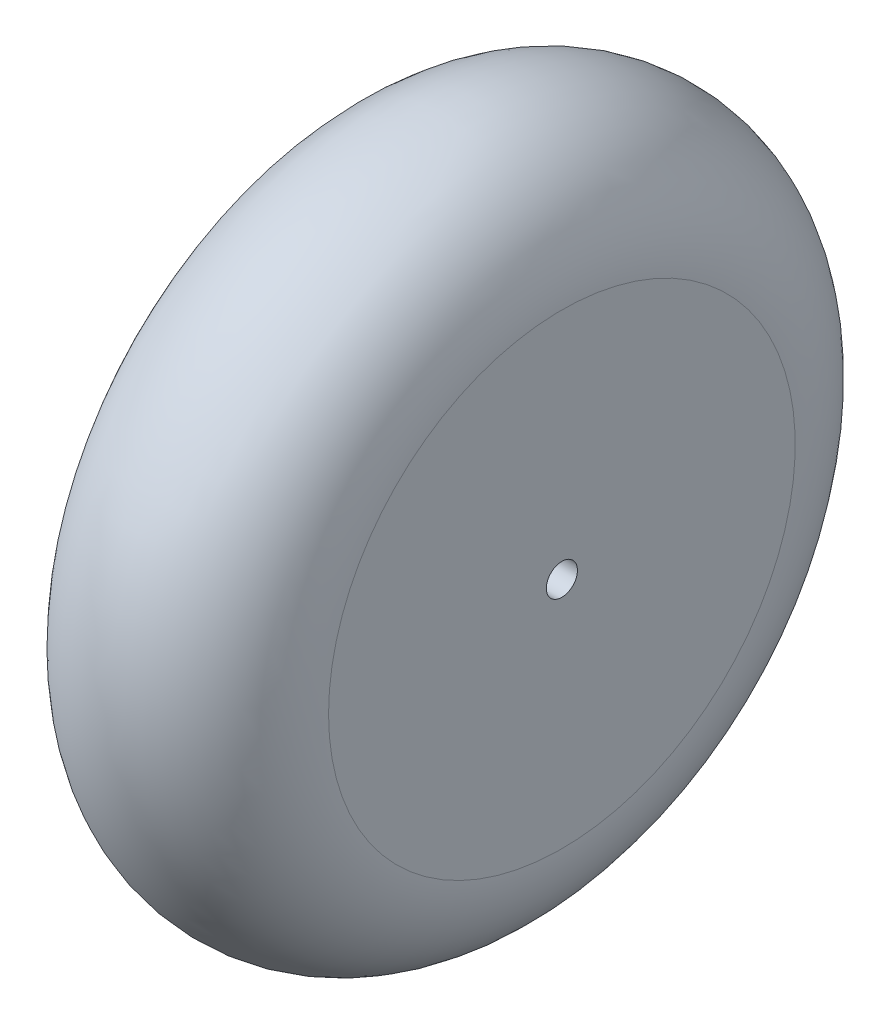
ISO-10303-21;
HEADER;
FILE_DESCRIPTION(('STEP AP214'),'2;1');
FILE_NAME('part.step','',(''),(''),'','','');
FILE_SCHEMA(('AUTOMOTIVE_DESIGN { 1 0 10303 214 1 1 1 1 }'));
ENDSEC;
DATA;
#1=APPLICATION_CONTEXT('core data for automotive mechanical design processes');
#2=APPLICATION_PROTOCOL_DEFINITION('international standard','automotive_design',2000,#1);
#3=PRODUCT_CONTEXT('',#1,'mechanical');
#4=PRODUCT('Part','Part','',(#3));
#5=PRODUCT_RELATED_PRODUCT_CATEGORY('part','',(#4));
#6=PRODUCT_DEFINITION_FORMATION('','',#4);
#7=PRODUCT_DEFINITION_CONTEXT('part definition',#1,'design');
#8=PRODUCT_DEFINITION('design','',#6,#7);
#9=PRODUCT_DEFINITION_SHAPE('','',#8);
#10=(LENGTH_UNIT() NAMED_UNIT(*) SI_UNIT(.MILLI.,.METRE.));
#11=(NAMED_UNIT(*) PLANE_ANGLE_UNIT() SI_UNIT($,.RADIAN.));
#12=(NAMED_UNIT(*) SI_UNIT($,.STERADIAN.) SOLID_ANGLE_UNIT());
#13=UNCERTAINTY_MEASURE_WITH_UNIT(LENGTH_MEASURE(1.E-05),#10,'distance_accuracy_value','');
#14=(GEOMETRIC_REPRESENTATION_CONTEXT(3) GLOBAL_UNCERTAINTY_ASSIGNED_CONTEXT((#13)) GLOBAL_UNIT_ASSIGNED_CONTEXT((#10,
#11,#12)) REPRESENTATION_CONTEXT('',''));
#15=CARTESIAN_POINT('',(0.,0.,0.));
#16=DIRECTION('',(0.,0.,1.));
#17=DIRECTION('',(1.,0.,0.));
#18=AXIS2_PLACEMENT_3D('',#15,#16,#17);
#19=CARTESIAN_POINT('',(0.,0.,0.));
#20=DIRECTION('',(-1.,0.,0.));
#21=DIRECTION('',(0.,0.,1.));
#22=AXIS2_PLACEMENT_3D('',#19,#20,#21);
#23=PLANE('',#22);
#24=CARTESIAN_POINT('',(0.,0.,0.));
#25=DIRECTION('',(1.,0.,0.));
#26=DIRECTION('',(0.,0.,-1.));
#27=AXIS2_PLACEMENT_3D('',#24,#25,#26);
#28=CIRCLE('',#27,2.);
#29=CARTESIAN_POINT('',(0.,0.,-2.));
#30=VERTEX_POINT('',#29);
#31=EDGE_CURVE('E41',#30,#30,#28,.T.);
#32=ORIENTED_EDGE('',*,*,#31,.T.);
#33=EDGE_LOOP('',(#32));
#34=FACE_BOUND('',#33,.T.);
#35=CARTESIAN_POINT('',(0.,0.,0.));
#36=DIRECTION('',(-1.,0.,0.));
#37=DIRECTION('',(0.,0.,1.));
#38=AXIS2_PLACEMENT_3D('',#35,#36,#37);
#39=CIRCLE('',#38,30.);
#40=CARTESIAN_POINT('',(0.,0.,30.));
#41=VERTEX_POINT('',#40);
#42=EDGE_CURVE('E10',#41,#41,#39,.T.);
#43=ORIENTED_EDGE('',*,*,#42,.T.);
#44=EDGE_LOOP('',(#43));
#45=FACE_BOUND('',#44,.T.);
#46=ADVANCED_FACE('F31',(#34,#45),#23,.T.);
#47=CARTESIAN_POINT('',(15.,0.,0.));
#48=DIRECTION('',(-1.,0.,0.));
#49=DIRECTION('',(0.,0.,1.));
#50=AXIS2_PLACEMENT_3D('',#47,#48,#49);
#51=TOROIDAL_SURFACE('',#50,30.,15.);
#52=CARTESIAN_POINT('',(30.,0.,0.));
#53=DIRECTION('',(-1.,0.,0.));
#54=DIRECTION('',(0.,0.,1.));
#55=AXIS2_PLACEMENT_3D('',#52,#53,#54);
#56=CIRCLE('',#55,30.);
#57=CARTESIAN_POINT('',(30.,0.,30.));
#58=VERTEX_POINT('',#57);
#59=EDGE_CURVE('E37',#58,#58,#56,.T.);
#60=ORIENTED_EDGE('',*,*,#59,.T.);
#61=EDGE_LOOP('',(#60));
#62=FACE_BOUND('',#61,.T.);
#63=ORIENTED_EDGE('',*,*,#42,.F.);
#64=EDGE_LOOP('',(#63));
#65=FACE_BOUND('',#64,.T.);
#66=ADVANCED_FACE('F56',(#62,#65),#51,.T.);
#67=CARTESIAN_POINT('',(30.,0.,0.));
#68=DIRECTION('',(-1.,0.,0.));
#69=DIRECTION('',(0.,0.,1.));
#70=AXIS2_PLACEMENT_3D('',#67,#68,#69);
#71=PLANE('',#70);
#72=CARTESIAN_POINT('',(30.,0.,0.));
#73=DIRECTION('',(1.,0.,0.));
#74=DIRECTION('',(0.,0.,-1.));
#75=AXIS2_PLACEMENT_3D('',#72,#73,#74);
#76=CIRCLE('',#75,2.);
#77=CARTESIAN_POINT('',(30.,0.,-2.));
#78=VERTEX_POINT('',#77);
#79=EDGE_CURVE('E45',#78,#78,#76,.T.);
#80=ORIENTED_EDGE('',*,*,#79,.F.);
#81=EDGE_LOOP('',(#80));
#82=FACE_BOUND('',#81,.T.);
#83=ORIENTED_EDGE('',*,*,#59,.F.);
#84=EDGE_LOOP('',(#83));
#85=FACE_BOUND('',#84,.T.);
#86=ADVANCED_FACE('F53',(#82,#85),#71,.F.);
#87=CARTESIAN_POINT('',(0.,0.,0.));
#88=DIRECTION('',(1.,0.,0.));
#89=DIRECTION('',(0.,0.,-1.));
#90=AXIS2_PLACEMENT_3D('',#87,#88,#89);
#91=CYLINDRICAL_SURFACE('',#90,2.);
#92=ORIENTED_EDGE('',*,*,#31,.F.);
#93=EDGE_LOOP('',(#92));
#94=FACE_BOUND('',#93,.T.);
#95=ORIENTED_EDGE('',*,*,#79,.T.);
#96=EDGE_LOOP('',(#95));
#97=FACE_BOUND('',#96,.T.);
#98=ADVANCED_FACE('F51',(#94,#97),#91,.F.);
#99=CLOSED_SHELL('',(#46,#66,#86,#98));
#100=MANIFOLD_SOLID_BREP('B2',#99);
#101=ADVANCED_BREP_SHAPE_REPRESENTATION('',(#18,#100),#14);
#102=SHAPE_DEFINITION_REPRESENTATION(#9,#101);
ENDSEC;
END-ISO-10303-21;
